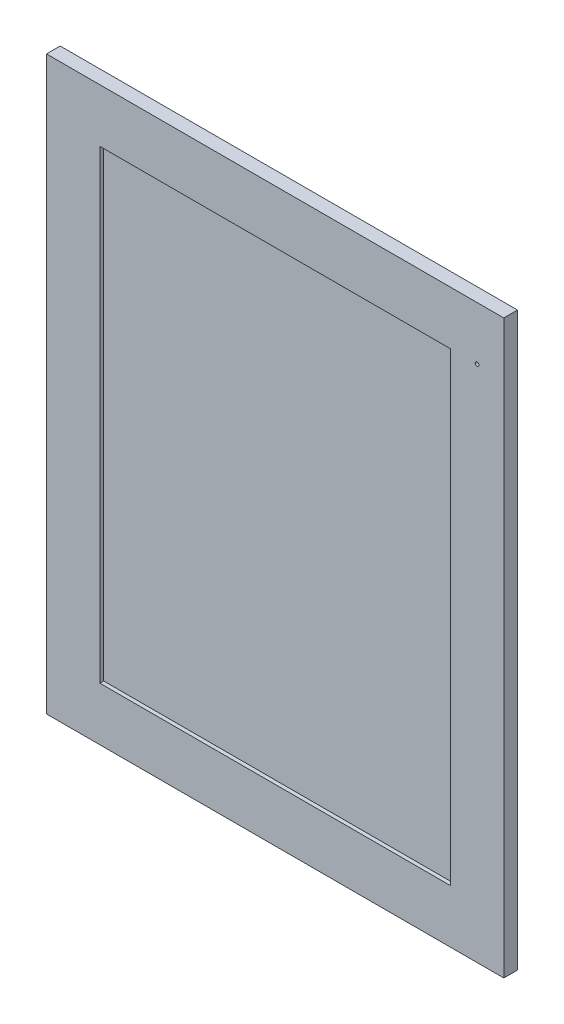
ISO-10303-21;
HEADER;
FILE_DESCRIPTION(('STEP AP214'),'2;1');
FILE_NAME('part.step','',(''),(''),'','','');
FILE_SCHEMA(('AUTOMOTIVE_DESIGN { 1 0 10303 214 1 1 1 1 }'));
ENDSEC;
DATA;
#1=APPLICATION_CONTEXT('core data for automotive mechanical design processes');
#2=APPLICATION_PROTOCOL_DEFINITION('international standard','automotive_design',2000,#1);
#3=PRODUCT_CONTEXT('',#1,'mechanical');
#4=PRODUCT('Part','Part','',(#3));
#5=PRODUCT_RELATED_PRODUCT_CATEGORY('part','',(#4));
#6=PRODUCT_DEFINITION_FORMATION('','',#4);
#7=PRODUCT_DEFINITION_CONTEXT('part definition',#1,'design');
#8=PRODUCT_DEFINITION('design','',#6,#7);
#9=PRODUCT_DEFINITION_SHAPE('','',#8);
#10=(LENGTH_UNIT() NAMED_UNIT(*) SI_UNIT(.MILLI.,.METRE.));
#11=(NAMED_UNIT(*) PLANE_ANGLE_UNIT() SI_UNIT($,.RADIAN.));
#12=(NAMED_UNIT(*) SI_UNIT($,.STERADIAN.) SOLID_ANGLE_UNIT());
#13=UNCERTAINTY_MEASURE_WITH_UNIT(LENGTH_MEASURE(1.E-05),#10,'distance_accuracy_value','');
#14=(GEOMETRIC_REPRESENTATION_CONTEXT(3) GLOBAL_UNCERTAINTY_ASSIGNED_CONTEXT((#13)) GLOBAL_UNIT_ASSIGNED_CONTEXT((#10,
#11,#12)) REPRESENTATION_CONTEXT('',''));
#15=CARTESIAN_POINT('',(0.,0.,0.));
#16=DIRECTION('',(0.,0.,1.));
#17=DIRECTION('',(1.,0.,0.));
#18=AXIS2_PLACEMENT_3D('',#15,#16,#17);
#19=CARTESIAN_POINT('',(0.,-750.,-18.));
#20=DIRECTION('',(1.,0.,0.));
#21=DIRECTION('',(0.,1.,0.));
#22=AXIS2_PLACEMENT_3D('',#19,#20,#21);
#23=PLANE('',#22);
#24=DIRECTION('',(0.,1.,0.));
#25=VECTOR('',#24,1.);
#26=CARTESIAN_POINT('',(0.,-750.,0.));
#27=LINE('',#26,#25);
#28=CARTESIAN_POINT('',(0.,-750.,0.));
#29=VERTEX_POINT('',#28);
#30=CARTESIAN_POINT('',(0.,0.,0.));
#31=VERTEX_POINT('',#30);
#32=EDGE_CURVE('E147',#29,#31,#27,.T.);
#33=ORIENTED_EDGE('',*,*,#32,.F.);
#34=DIRECTION('',(0.,0.,1.));
#35=VECTOR('',#34,1.);
#36=CARTESIAN_POINT('',(0.,-750.,-18.));
#37=LINE('',#36,#35);
#38=CARTESIAN_POINT('',(0.,-750.,-18.));
#39=VERTEX_POINT('',#38);
#40=EDGE_CURVE('E11',#39,#29,#37,.T.);
#41=ORIENTED_EDGE('',*,*,#40,.F.);
#42=DIRECTION('',(0.,1.,0.));
#43=VECTOR('',#42,1.);
#44=CARTESIAN_POINT('',(0.,-750.,-18.));
#45=LINE('',#44,#43);
#46=CARTESIAN_POINT('',(0.,0.,-18.));
#47=VERTEX_POINT('',#46);
#48=EDGE_CURVE('E150',#39,#47,#45,.T.);
#49=ORIENTED_EDGE('',*,*,#48,.T.);
#50=DIRECTION('',(0.,0.,1.));
#51=VECTOR('',#50,1.);
#52=CARTESIAN_POINT('',(0.,0.,-18.));
#53=LINE('',#52,#51);
#54=EDGE_CURVE('E36',#47,#31,#53,.T.);
#55=ORIENTED_EDGE('',*,*,#54,.T.);
#56=EDGE_LOOP('',(#33,#41,#49,#55));
#57=FACE_BOUND('',#56,.T.);
#58=ADVANCED_FACE('F33',(#57),#23,.T.);
#59=CARTESIAN_POINT('',(0.,-750.,-18.));
#60=DIRECTION('',(0.,-1.,0.));
#61=DIRECTION('',(1.,0.,0.));
#62=AXIS2_PLACEMENT_3D('',#59,#60,#61);
#63=PLANE('',#62);
#64=DIRECTION('',(1.,0.,0.));
#65=VECTOR('',#64,1.);
#66=CARTESIAN_POINT('',(0.,-750.,0.));
#67=LINE('',#66,#65);
#68=CARTESIAN_POINT('',(-600.,-750.,0.));
#69=VERTEX_POINT('',#68);
#70=EDGE_CURVE('E153',#69,#29,#67,.T.);
#71=ORIENTED_EDGE('',*,*,#70,.F.);
#72=DIRECTION('',(0.,0.,1.));
#73=VECTOR('',#72,1.);
#74=CARTESIAN_POINT('',(-600.,-750.,-18.));
#75=LINE('',#74,#73);
#76=CARTESIAN_POINT('',(-600.,-750.,-18.));
#77=VERTEX_POINT('',#76);
#78=EDGE_CURVE('E41',#77,#69,#75,.T.);
#79=ORIENTED_EDGE('',*,*,#78,.F.);
#80=DIRECTION('',(1.,0.,0.));
#81=VECTOR('',#80,1.);
#82=CARTESIAN_POINT('',(0.,-750.,-18.));
#83=LINE('',#82,#81);
#84=EDGE_CURVE('E158',#77,#39,#83,.T.);
#85=ORIENTED_EDGE('',*,*,#84,.T.);
#86=ORIENTED_EDGE('',*,*,#40,.T.);
#87=EDGE_LOOP('',(#71,#79,#85,#86));
#88=FACE_BOUND('',#87,.T.);
#89=ADVANCED_FACE('F175',(#88),#63,.T.);
#90=CARTESIAN_POINT('',(-600.,-750.,-18.));
#91=DIRECTION('',(-1.,0.,0.));
#92=DIRECTION('',(0.,0.,1.));
#93=AXIS2_PLACEMENT_3D('',#90,#91,#92);
#94=PLANE('',#93);
#95=DIRECTION('',(0.,-1.,0.));
#96=VECTOR('',#95,1.);
#97=CARTESIAN_POINT('',(-600.,-750.,0.));
#98=LINE('',#97,#96);
#99=CARTESIAN_POINT('',(-600.,0.,0.));
#100=VERTEX_POINT('',#99);
#101=EDGE_CURVE('E165',#100,#69,#98,.T.);
#102=ORIENTED_EDGE('',*,*,#101,.F.);
#103=DIRECTION('',(0.,0.,1.));
#104=VECTOR('',#103,1.);
#105=CARTESIAN_POINT('',(-600.,0.,-18.));
#106=LINE('',#105,#104);
#107=CARTESIAN_POINT('',(-600.,0.,-18.));
#108=VERTEX_POINT('',#107);
#109=EDGE_CURVE('E170',#108,#100,#106,.T.);
#110=ORIENTED_EDGE('',*,*,#109,.F.);
#111=DIRECTION('',(0.,-1.,0.));
#112=VECTOR('',#111,1.);
#113=CARTESIAN_POINT('',(-600.,-750.,-18.));
#114=LINE('',#113,#112);
#115=EDGE_CURVE('E155',#108,#77,#114,.T.);
#116=ORIENTED_EDGE('',*,*,#115,.T.);
#117=ORIENTED_EDGE('',*,*,#78,.T.);
#118=EDGE_LOOP('',(#102,#110,#116,#117));
#119=FACE_BOUND('',#118,.T.);
#120=ADVANCED_FACE('F179',(#119),#94,.T.);
#121=CARTESIAN_POINT('',(0.,0.,-18.));
#122=DIRECTION('',(0.,1.,0.));
#123=DIRECTION('',(-1.,0.,0.));
#124=AXIS2_PLACEMENT_3D('',#121,#122,#123);
#125=PLANE('',#124);
#126=DIRECTION('',(-1.,0.,0.));
#127=VECTOR('',#126,1.);
#128=CARTESIAN_POINT('',(0.,0.,0.));
#129=LINE('',#128,#127);
#130=EDGE_CURVE('E162',#31,#100,#129,.T.);
#131=ORIENTED_EDGE('',*,*,#130,.F.);
#132=ORIENTED_EDGE('',*,*,#54,.F.);
#133=DIRECTION('',(-1.,0.,0.));
#134=VECTOR('',#133,1.);
#135=CARTESIAN_POINT('',(0.,0.,-18.));
#136=LINE('',#135,#134);
#137=EDGE_CURVE('E152',#47,#108,#136,.T.);
#138=ORIENTED_EDGE('',*,*,#137,.T.);
#139=ORIENTED_EDGE('',*,*,#109,.T.);
#140=EDGE_LOOP('',(#131,#132,#138,#139));
#141=FACE_BOUND('',#140,.T.);
#142=ADVANCED_FACE('F172',(#141),#125,.T.);
#143=CARTESIAN_POINT('',(0.,0.,-18.));
#144=DIRECTION('',(0.,0.,1.));
#145=DIRECTION('',(1.,0.,0.));
#146=AXIS2_PLACEMENT_3D('',#143,#144,#145);
#147=PLANE('',#146);
#148=CARTESIAN_POINT('',(-35.,-70.0000000000001,-18.));
#149=DIRECTION('',(0.,0.,1.));
#150=DIRECTION('',(1.,0.,0.));
#151=AXIS2_PLACEMENT_3D('',#148,#149,#150);
#152=CIRCLE('',#151,2.5);
#153=CARTESIAN_POINT('',(-32.5,-70.0000000000001,-18.));
#154=VERTEX_POINT('',#153);
#155=EDGE_CURVE('E144',#154,#154,#152,.T.);
#156=ORIENTED_EDGE('',*,*,#155,.T.);
#157=EDGE_LOOP('',(#156));
#158=FACE_BOUND('',#157,.T.);
#159=ORIENTED_EDGE('',*,*,#48,.F.);
#160=ORIENTED_EDGE('',*,*,#84,.F.);
#161=ORIENTED_EDGE('',*,*,#115,.F.);
#162=ORIENTED_EDGE('',*,*,#137,.F.);
#163=EDGE_LOOP('',(#159,#160,#161,#162));
#164=FACE_BOUND('',#163,.T.);
#165=ADVANCED_FACE('F181',(#158,#164),#147,.F.);
#166=CARTESIAN_POINT('',(0.,0.,0.));
#167=DIRECTION('',(0.,0.,1.));
#168=DIRECTION('',(1.,0.,0.));
#169=AXIS2_PLACEMENT_3D('',#166,#167,#168);
#170=PLANE('',#169);
#171=DIRECTION('',(1.,0.,0.));
#172=VECTOR('',#171,1.);
#173=CARTESIAN_POINT('',(-530.,-680.,0.));
#174=LINE('',#173,#172);
#175=CARTESIAN_POINT('',(-530.,-680.,0.));
#176=VERTEX_POINT('',#175);
#177=CARTESIAN_POINT('',(-70.,-680.,0.));
#178=VERTEX_POINT('',#177);
#179=EDGE_CURVE('E49',#176,#178,#174,.T.);
#180=ORIENTED_EDGE('',*,*,#179,.F.);
#181=DIRECTION('',(0.,-1.,0.));
#182=VECTOR('',#181,1.);
#183=CARTESIAN_POINT('',(-530.,-70.0000000000001,0.));
#184=LINE('',#183,#182);
#185=CARTESIAN_POINT('',(-530.,-70.0000000000001,0.));
#186=VERTEX_POINT('',#185);
#187=EDGE_CURVE('E125',#186,#176,#184,.T.);
#188=ORIENTED_EDGE('',*,*,#187,.F.);
#189=DIRECTION('',(-1.,0.,0.));
#190=VECTOR('',#189,1.);
#191=CARTESIAN_POINT('',(-70.,-70.,0.));
#192=LINE('',#191,#190);
#193=CARTESIAN_POINT('',(-70.,-70.,0.));
#194=VERTEX_POINT('',#193);
#195=EDGE_CURVE('E128',#194,#186,#192,.T.);
#196=ORIENTED_EDGE('',*,*,#195,.F.);
#197=DIRECTION('',(0.,1.,0.));
#198=VECTOR('',#197,1.);
#199=CARTESIAN_POINT('',(-70.,-680.,0.));
#200=LINE('',#199,#198);
#201=EDGE_CURVE('E134',#178,#194,#200,.T.);
#202=ORIENTED_EDGE('',*,*,#201,.F.);
#203=EDGE_LOOP('',(#180,#188,#196,#202));
#204=FACE_BOUND('',#203,.T.);
#205=CARTESIAN_POINT('',(-35.,-70.0000000000001,0.));
#206=DIRECTION('',(0.,0.,1.));
#207=DIRECTION('',(1.,0.,0.));
#208=AXIS2_PLACEMENT_3D('',#205,#206,#207);
#209=CIRCLE('',#208,2.5);
#210=CARTESIAN_POINT('',(-32.5,-70.0000000000001,0.));
#211=VERTEX_POINT('',#210);
#212=EDGE_CURVE('E140',#211,#211,#209,.T.);
#213=ORIENTED_EDGE('',*,*,#212,.F.);
#214=EDGE_LOOP('',(#213));
#215=FACE_BOUND('',#214,.T.);
#216=ORIENTED_EDGE('',*,*,#32,.T.);
#217=ORIENTED_EDGE('',*,*,#130,.T.);
#218=ORIENTED_EDGE('',*,*,#101,.T.);
#219=ORIENTED_EDGE('',*,*,#70,.T.);
#220=EDGE_LOOP('',(#216,#217,#218,#219));
#221=FACE_BOUND('',#220,.T.);
#222=ADVANCED_FACE('F174',(#204,#215,#221),#170,.T.);
#223=CARTESIAN_POINT('',(-35.,-70.0000000000001,-18.));
#224=DIRECTION('',(0.,0.,1.));
#225=DIRECTION('',(1.,0.,0.));
#226=AXIS2_PLACEMENT_3D('',#223,#224,#225);
#227=CYLINDRICAL_SURFACE('',#226,2.5);
#228=ORIENTED_EDGE('',*,*,#155,.F.);
#229=EDGE_LOOP('',(#228));
#230=FACE_BOUND('',#229,.T.);
#231=ORIENTED_EDGE('',*,*,#212,.T.);
#232=EDGE_LOOP('',(#231));
#233=FACE_BOUND('',#232,.T.);
#234=ADVANCED_FACE('F189',(#230,#233),#227,.F.);
#235=CARTESIAN_POINT('',(-530.,-680.,-5.));
#236=DIRECTION('',(0.,-1.,0.));
#237=DIRECTION('',(1.,0.,0.));
#238=AXIS2_PLACEMENT_3D('',#235,#236,#237);
#239=PLANE('',#238);
#240=ORIENTED_EDGE('',*,*,#179,.T.);
#241=DIRECTION('',(0.,0.,1.));
#242=VECTOR('',#241,1.);
#243=CARTESIAN_POINT('',(-70.,-680.,-5.));
#244=LINE('',#243,#242);
#245=CARTESIAN_POINT('',(-70.,-680.,-5.));
#246=VERTEX_POINT('',#245);
#247=EDGE_CURVE('E103',#246,#178,#244,.T.);
#248=ORIENTED_EDGE('',*,*,#247,.F.);
#249=DIRECTION('',(1.,0.,0.));
#250=VECTOR('',#249,1.);
#251=CARTESIAN_POINT('',(-530.,-680.,-5.));
#252=LINE('',#251,#250);
#253=CARTESIAN_POINT('',(-530.,-680.,-5.));
#254=VERTEX_POINT('',#253);
#255=EDGE_CURVE('E107',#254,#246,#252,.T.);
#256=ORIENTED_EDGE('',*,*,#255,.F.);
#257=DIRECTION('',(0.,0.,1.));
#258=VECTOR('',#257,1.);
#259=CARTESIAN_POINT('',(-530.,-680.,-5.));
#260=LINE('',#259,#258);
#261=EDGE_CURVE('E138',#254,#176,#260,.T.);
#262=ORIENTED_EDGE('',*,*,#261,.T.);
#263=EDGE_LOOP('',(#240,#248,#256,#262));
#264=FACE_BOUND('',#263,.T.);
#265=ADVANCED_FACE('F105',(#264),#239,.F.);
#266=CARTESIAN_POINT('',(-530.,-70.0000000000001,-5.));
#267=DIRECTION('',(-1.,0.,0.));
#268=DIRECTION('',(0.,0.,1.));
#269=AXIS2_PLACEMENT_3D('',#266,#267,#268);
#270=PLANE('',#269);
#271=ORIENTED_EDGE('',*,*,#187,.T.);
#272=ORIENTED_EDGE('',*,*,#261,.F.);
#273=DIRECTION('',(0.,-1.,0.));
#274=VECTOR('',#273,1.);
#275=CARTESIAN_POINT('',(-530.,-70.0000000000001,-5.));
#276=LINE('',#275,#274);
#277=CARTESIAN_POINT('',(-530.,-70.0000000000001,-5.));
#278=VERTEX_POINT('',#277);
#279=EDGE_CURVE('E113',#278,#254,#276,.T.);
#280=ORIENTED_EDGE('',*,*,#279,.F.);
#281=DIRECTION('',(0.,0.,1.));
#282=VECTOR('',#281,1.);
#283=CARTESIAN_POINT('',(-530.,-70.0000000000001,-5.));
#284=LINE('',#283,#282);
#285=EDGE_CURVE('E141',#278,#186,#284,.T.);
#286=ORIENTED_EDGE('',*,*,#285,.T.);
#287=EDGE_LOOP('',(#271,#272,#280,#286));
#288=FACE_BOUND('',#287,.T.);
#289=ADVANCED_FACE('F235',(#288),#270,.F.);
#290=CARTESIAN_POINT('',(-70.,-70.,-5.));
#291=DIRECTION('',(0.,1.,0.));
#292=DIRECTION('',(-1.,0.,0.));
#293=AXIS2_PLACEMENT_3D('',#290,#291,#292);
#294=PLANE('',#293);
#295=ORIENTED_EDGE('',*,*,#195,.T.);
#296=ORIENTED_EDGE('',*,*,#285,.F.);
#297=DIRECTION('',(-1.,0.,0.));
#298=VECTOR('',#297,1.);
#299=CARTESIAN_POINT('',(-70.,-70.,-5.));
#300=LINE('',#299,#298);
#301=CARTESIAN_POINT('',(-70.,-70.,-5.));
#302=VERTEX_POINT('',#301);
#303=EDGE_CURVE('E121',#302,#278,#300,.T.);
#304=ORIENTED_EDGE('',*,*,#303,.F.);
#305=DIRECTION('',(0.,0.,1.));
#306=VECTOR('',#305,1.);
#307=CARTESIAN_POINT('',(-70.,-70.,-5.));
#308=LINE('',#307,#306);
#309=EDGE_CURVE('E112',#302,#194,#308,.T.);
#310=ORIENTED_EDGE('',*,*,#309,.T.);
#311=EDGE_LOOP('',(#295,#296,#304,#310));
#312=FACE_BOUND('',#311,.T.);
#313=ADVANCED_FACE('F244',(#312),#294,.F.);
#314=CARTESIAN_POINT('',(-70.,-680.,-5.));
#315=DIRECTION('',(1.,0.,0.));
#316=DIRECTION('',(0.,1.,0.));
#317=AXIS2_PLACEMENT_3D('',#314,#315,#316);
#318=PLANE('',#317);
#319=ORIENTED_EDGE('',*,*,#201,.T.);
#320=ORIENTED_EDGE('',*,*,#309,.F.);
#321=DIRECTION('',(0.,1.,0.));
#322=VECTOR('',#321,1.);
#323=CARTESIAN_POINT('',(-70.,-680.,-5.));
#324=LINE('',#323,#322);
#325=EDGE_CURVE('E116',#246,#302,#324,.T.);
#326=ORIENTED_EDGE('',*,*,#325,.F.);
#327=ORIENTED_EDGE('',*,*,#247,.T.);
#328=EDGE_LOOP('',(#319,#320,#326,#327));
#329=FACE_BOUND('',#328,.T.);
#330=ADVANCED_FACE('F117',(#329),#318,.F.);
#331=CARTESIAN_POINT('',(-70.,-680.,-5.));
#332=DIRECTION('',(0.,0.,1.));
#333=DIRECTION('',(1.,0.,0.));
#334=AXIS2_PLACEMENT_3D('',#331,#332,#333);
#335=PLANE('',#334);
#336=ORIENTED_EDGE('',*,*,#255,.T.);
#337=ORIENTED_EDGE('',*,*,#325,.T.);
#338=ORIENTED_EDGE('',*,*,#303,.T.);
#339=ORIENTED_EDGE('',*,*,#279,.T.);
#340=EDGE_LOOP('',(#336,#337,#338,#339));
#341=FACE_BOUND('',#340,.T.);
#342=ADVANCED_FACE('F123',(#341),#335,.T.);
#343=CLOSED_SHELL('',(#58,#89,#120,#142,#165,#222,#234,#265,#289,#313,#330,#342));
#344=MANIFOLD_SOLID_BREP('B2',#343);
#345=ADVANCED_BREP_SHAPE_REPRESENTATION('',(#18,#344),#14);
#346=SHAPE_DEFINITION_REPRESENTATION(#9,#345);
ENDSEC;
END-ISO-10303-21;
